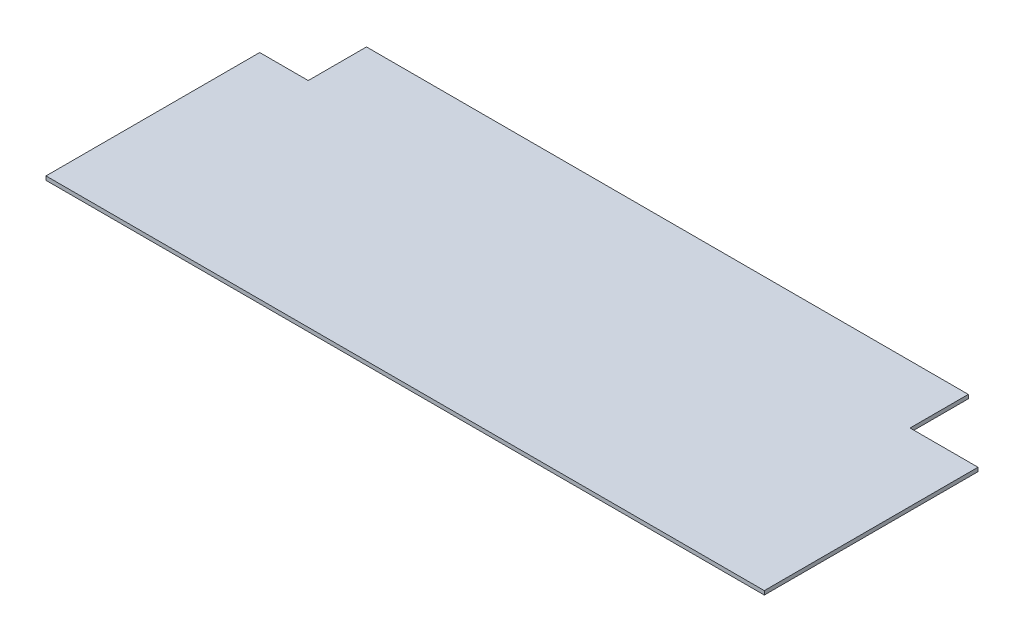
ISO-10303-21;
HEADER;
FILE_DESCRIPTION(('STEP AP214'),'2;1');
FILE_NAME('part.step','',(''),(''),'','','');
FILE_SCHEMA(('AUTOMOTIVE_DESIGN { 1 0 10303 214 1 1 1 1 }'));
ENDSEC;
DATA;
#1=APPLICATION_CONTEXT('core data for automotive mechanical design processes');
#2=APPLICATION_PROTOCOL_DEFINITION('international standard','automotive_design',2000,#1);
#3=PRODUCT_CONTEXT('',#1,'mechanical');
#4=PRODUCT('Part','Part','',(#3));
#5=PRODUCT_RELATED_PRODUCT_CATEGORY('part','',(#4));
#6=PRODUCT_DEFINITION_FORMATION('','',#4);
#7=PRODUCT_DEFINITION_CONTEXT('part definition',#1,'design');
#8=PRODUCT_DEFINITION('design','',#6,#7);
#9=PRODUCT_DEFINITION_SHAPE('','',#8);
#10=(LENGTH_UNIT() NAMED_UNIT(*) SI_UNIT(.MILLI.,.METRE.));
#11=(NAMED_UNIT(*) PLANE_ANGLE_UNIT() SI_UNIT($,.RADIAN.));
#12=(NAMED_UNIT(*) SI_UNIT($,.STERADIAN.) SOLID_ANGLE_UNIT());
#13=UNCERTAINTY_MEASURE_WITH_UNIT(LENGTH_MEASURE(1.E-05),#10,'distance_accuracy_value','');
#14=(GEOMETRIC_REPRESENTATION_CONTEXT(3) GLOBAL_UNCERTAINTY_ASSIGNED_CONTEXT((#13)) GLOBAL_UNIT_ASSIGNED_CONTEXT((#10,
#11,#12)) REPRESENTATION_CONTEXT('',''));
#15=CARTESIAN_POINT('',(0.,0.,0.));
#16=DIRECTION('',(0.,0.,1.));
#17=DIRECTION('',(1.,0.,0.));
#18=AXIS2_PLACEMENT_3D('',#15,#16,#17);
#19=CARTESIAN_POINT('',(301.178602807675,2.54,0.));
#20=DIRECTION('',(1.,0.,0.));
#21=DIRECTION('',(0.,0.,-1.));
#22=AXIS2_PLACEMENT_3D('',#19,#20,#21);
#23=PLANE('',#22);
#24=DIRECTION('',(0.,0.,1.));
#25=VECTOR('',#24,1.);
#26=CARTESIAN_POINT('',(301.178602807675,0.,0.));
#27=LINE('',#26,#25);
#28=CARTESIAN_POINT('',(301.178602807675,0.,-178.4112679147));
#29=VERTEX_POINT('',#28);
#30=CARTESIAN_POINT('',(301.178602807675,0.,-140.3112679147));
#31=VERTEX_POINT('',#30);
#32=EDGE_CURVE('E133',#29,#31,#27,.T.);
#33=ORIENTED_EDGE('',*,*,#32,.F.);
#34=DIRECTION('',(0.,-1.,0.));
#35=VECTOR('',#34,1.);
#36=CARTESIAN_POINT('',(301.178602807675,2.54,-178.4112679147));
#37=LINE('',#36,#35);
#38=CARTESIAN_POINT('',(301.178602807675,2.54,-178.4112679147));
#39=VERTEX_POINT('',#38);
#40=EDGE_CURVE('E11',#39,#29,#37,.T.);
#41=ORIENTED_EDGE('',*,*,#40,.F.);
#42=DIRECTION('',(0.,0.,1.));
#43=VECTOR('',#42,1.);
#44=CARTESIAN_POINT('',(301.178602807675,2.54,0.));
#45=LINE('',#44,#43);
#46=CARTESIAN_POINT('',(301.178602807675,2.54,-140.3112679147));
#47=VERTEX_POINT('',#46);
#48=EDGE_CURVE('E152',#39,#47,#45,.T.);
#49=ORIENTED_EDGE('',*,*,#48,.T.);
#50=DIRECTION('',(0.,-1.,0.));
#51=VECTOR('',#50,1.);
#52=CARTESIAN_POINT('',(301.178602807675,2.54,-140.3112679147));
#53=LINE('',#52,#51);
#54=EDGE_CURVE('E92',#47,#31,#53,.T.);
#55=ORIENTED_EDGE('',*,*,#54,.T.);
#56=EDGE_LOOP('',(#33,#41,#49,#55));
#57=FACE_BOUND('',#56,.T.);
#58=ADVANCED_FACE('F41',(#57),#23,.T.);
#59=CARTESIAN_POINT('',(0.,2.54,-178.4112679147));
#60=DIRECTION('',(0.,0.,-1.));
#61=DIRECTION('',(-1.,0.,0.));
#62=AXIS2_PLACEMENT_3D('',#59,#60,#61);
#63=PLANE('',#62);
#64=DIRECTION('',(1.,0.,0.));
#65=VECTOR('',#64,1.);
#66=CARTESIAN_POINT('',(0.,0.,-178.4112679147));
#67=LINE('',#66,#65);
#68=CARTESIAN_POINT('',(-92.5227972403219,0.,-178.4112679147));
#69=VERTEX_POINT('',#68);
#70=EDGE_CURVE('E136',#69,#29,#67,.T.);
#71=ORIENTED_EDGE('',*,*,#70,.F.);
#72=DIRECTION('',(0.,-1.,0.));
#73=VECTOR('',#72,1.);
#74=CARTESIAN_POINT('',(-92.5227972403219,2.54,-178.4112679147));
#75=LINE('',#74,#73);
#76=CARTESIAN_POINT('',(-92.5227972403219,2.54,-178.4112679147));
#77=VERTEX_POINT('',#76);
#78=EDGE_CURVE('E49',#77,#69,#75,.T.);
#79=ORIENTED_EDGE('',*,*,#78,.F.);
#80=DIRECTION('',(1.,0.,0.));
#81=VECTOR('',#80,1.);
#82=CARTESIAN_POINT('',(0.,2.54,-178.4112679147));
#83=LINE('',#82,#81);
#84=EDGE_CURVE('E173',#77,#39,#83,.T.);
#85=ORIENTED_EDGE('',*,*,#84,.T.);
#86=ORIENTED_EDGE('',*,*,#40,.T.);
#87=EDGE_LOOP('',(#71,#79,#85,#86));
#88=FACE_BOUND('',#87,.T.);
#89=ADVANCED_FACE('F172',(#88),#63,.T.);
#90=CARTESIAN_POINT('',(-92.5227972403219,2.54,0.));
#91=DIRECTION('',(1.,0.,0.));
#92=DIRECTION('',(0.,0.,-1.));
#93=AXIS2_PLACEMENT_3D('',#90,#91,#92);
#94=PLANE('',#93);
#95=DIRECTION('',(0.,0.,1.));
#96=VECTOR('',#95,1.);
#97=CARTESIAN_POINT('',(-92.5227972403219,0.,0.));
#98=LINE('',#97,#96);
#99=CARTESIAN_POINT('',(-92.5227972403219,0.,-140.3112679147));
#100=VERTEX_POINT('',#99);
#101=EDGE_CURVE('E139',#69,#100,#98,.T.);
#102=ORIENTED_EDGE('',*,*,#101,.T.);
#103=DIRECTION('',(0.,-1.,0.));
#104=VECTOR('',#103,1.);
#105=CARTESIAN_POINT('',(-92.5227972403219,2.54,-140.3112679147));
#106=LINE('',#105,#104);
#107=CARTESIAN_POINT('',(-92.5227972403219,2.54,-140.3112679147));
#108=VERTEX_POINT('',#107);
#109=EDGE_CURVE('E158',#108,#100,#106,.T.);
#110=ORIENTED_EDGE('',*,*,#109,.F.);
#111=DIRECTION('',(0.,0.,1.));
#112=VECTOR('',#111,1.);
#113=CARTESIAN_POINT('',(-92.5227972403219,2.54,0.));
#114=LINE('',#113,#112);
#115=EDGE_CURVE('E164',#77,#108,#114,.T.);
#116=ORIENTED_EDGE('',*,*,#115,.F.);
#117=ORIENTED_EDGE('',*,*,#78,.T.);
#118=EDGE_LOOP('',(#102,#110,#116,#117));
#119=FACE_BOUND('',#118,.T.);
#120=ADVANCED_FACE('F162',(#119),#94,.F.);
#121=CARTESIAN_POINT('',(0.,2.54,-140.3112679147));
#122=DIRECTION('',(0.,0.,-1.));
#123=DIRECTION('',(-1.,0.,0.));
#124=AXIS2_PLACEMENT_3D('',#121,#122,#123);
#125=PLANE('',#124);
#126=DIRECTION('',(1.,0.,0.));
#127=VECTOR('',#126,1.);
#128=CARTESIAN_POINT('',(0.,0.,-140.3112679147));
#129=LINE('',#128,#127);
#130=CARTESIAN_POINT('',(-124.272797240322,0.,-140.3112679147));
#131=VERTEX_POINT('',#130);
#132=EDGE_CURVE('E142',#131,#100,#129,.T.);
#133=ORIENTED_EDGE('',*,*,#132,.F.);
#134=DIRECTION('',(0.,-1.,0.));
#135=VECTOR('',#134,1.);
#136=CARTESIAN_POINT('',(-124.272797240322,2.54,-140.3112679147));
#137=LINE('',#136,#135);
#138=CARTESIAN_POINT('',(-124.272797240322,2.54,-140.3112679147));
#139=VERTEX_POINT('',#138);
#140=EDGE_CURVE('E156',#139,#131,#137,.T.);
#141=ORIENTED_EDGE('',*,*,#140,.F.);
#142=DIRECTION('',(1.,0.,0.));
#143=VECTOR('',#142,1.);
#144=CARTESIAN_POINT('',(0.,2.54,-140.3112679147));
#145=LINE('',#144,#143);
#146=EDGE_CURVE('E181',#139,#108,#145,.T.);
#147=ORIENTED_EDGE('',*,*,#146,.T.);
#148=ORIENTED_EDGE('',*,*,#109,.T.);
#149=EDGE_LOOP('',(#133,#141,#147,#148));
#150=FACE_BOUND('',#149,.T.);
#151=ADVANCED_FACE('F187',(#150),#125,.T.);
#152=CARTESIAN_POINT('',(-124.272797240322,2.54,0.));
#153=DIRECTION('',(-1.,0.,0.));
#154=DIRECTION('',(0.,0.,1.));
#155=AXIS2_PLACEMENT_3D('',#152,#153,#154);
#156=PLANE('',#155);
#157=DIRECTION('',(0.,0.,-1.));
#158=VECTOR('',#157,1.);
#159=CARTESIAN_POINT('',(-124.272797240322,0.,0.));
#160=LINE('',#159,#158);
#161=CARTESIAN_POINT('',(-124.272797240322,0.,-0.515267914670478));
#162=VERTEX_POINT('',#161);
#163=EDGE_CURVE('E145',#162,#131,#160,.T.);
#164=ORIENTED_EDGE('',*,*,#163,.F.);
#165=DIRECTION('',(0.,-1.,0.));
#166=VECTOR('',#165,1.);
#167=CARTESIAN_POINT('',(-124.272797240322,2.54,-0.515267914670478));
#168=LINE('',#167,#166);
#169=CARTESIAN_POINT('',(-124.272797240322,2.54,-0.515267914670478));
#170=VERTEX_POINT('',#169);
#171=EDGE_CURVE('E125',#170,#162,#168,.T.);
#172=ORIENTED_EDGE('',*,*,#171,.F.);
#173=DIRECTION('',(0.,0.,-1.));
#174=VECTOR('',#173,1.);
#175=CARTESIAN_POINT('',(-124.272797240322,2.54,0.));
#176=LINE('',#175,#174);
#177=EDGE_CURVE('E118',#170,#139,#176,.T.);
#178=ORIENTED_EDGE('',*,*,#177,.T.);
#179=ORIENTED_EDGE('',*,*,#140,.T.);
#180=EDGE_LOOP('',(#164,#172,#178,#179));
#181=FACE_BOUND('',#180,.T.);
#182=ADVANCED_FACE('F185',(#181),#156,.T.);
#183=CARTESIAN_POINT('',(0.,2.54,-0.515267914670478));
#184=DIRECTION('',(0.,0.,-1.));
#185=DIRECTION('',(-1.,0.,0.));
#186=AXIS2_PLACEMENT_3D('',#183,#184,#185);
#187=PLANE('',#186);
#188=DIRECTION('',(1.,0.,0.));
#189=VECTOR('',#188,1.);
#190=CARTESIAN_POINT('',(0.,0.,-0.515267914670478));
#191=LINE('',#190,#189);
#192=CARTESIAN_POINT('',(345.628602807675,0.,-0.515267914670478));
#193=VERTEX_POINT('',#192);
#194=EDGE_CURVE('E124',#162,#193,#191,.T.);
#195=ORIENTED_EDGE('',*,*,#194,.T.);
#196=DIRECTION('',(0.,-1.,0.));
#197=VECTOR('',#196,1.);
#198=CARTESIAN_POINT('',(345.628602807675,2.54,-0.515267914670478));
#199=LINE('',#198,#197);
#200=CARTESIAN_POINT('',(345.628602807675,2.54,-0.515267914670478));
#201=VERTEX_POINT('',#200);
#202=EDGE_CURVE('E121',#201,#193,#199,.T.);
#203=ORIENTED_EDGE('',*,*,#202,.F.);
#204=DIRECTION('',(1.,0.,0.));
#205=VECTOR('',#204,1.);
#206=CARTESIAN_POINT('',(0.,2.54,-0.515267914670478));
#207=LINE('',#206,#205);
#208=EDGE_CURVE('E111',#170,#201,#207,.T.);
#209=ORIENTED_EDGE('',*,*,#208,.F.);
#210=ORIENTED_EDGE('',*,*,#171,.T.);
#211=EDGE_LOOP('',(#195,#203,#209,#210));
#212=FACE_BOUND('',#211,.T.);
#213=ADVANCED_FACE('F122',(#212),#187,.F.);
#214=CARTESIAN_POINT('',(345.628602807675,2.54,0.));
#215=DIRECTION('',(-1.,0.,0.));
#216=DIRECTION('',(0.,0.,1.));
#217=AXIS2_PLACEMENT_3D('',#214,#215,#216);
#218=PLANE('',#217);
#219=DIRECTION('',(0.,0.,-1.));
#220=VECTOR('',#219,1.);
#221=CARTESIAN_POINT('',(345.628602807675,0.,0.));
#222=LINE('',#221,#220);
#223=CARTESIAN_POINT('',(345.628602807675,0.,-140.3112679147));
#224=VERTEX_POINT('',#223);
#225=EDGE_CURVE('E85',#193,#224,#222,.T.);
#226=ORIENTED_EDGE('',*,*,#225,.T.);
#227=DIRECTION('',(0.,-1.,0.));
#228=VECTOR('',#227,1.);
#229=CARTESIAN_POINT('',(345.628602807675,2.54,-140.3112679147));
#230=LINE('',#229,#228);
#231=CARTESIAN_POINT('',(345.628602807675,2.54,-140.3112679147));
#232=VERTEX_POINT('',#231);
#233=EDGE_CURVE('E126',#232,#224,#230,.T.);
#234=ORIENTED_EDGE('',*,*,#233,.F.);
#235=DIRECTION('',(0.,0.,-1.));
#236=VECTOR('',#235,1.);
#237=CARTESIAN_POINT('',(345.628602807675,2.54,0.));
#238=LINE('',#237,#236);
#239=EDGE_CURVE('E115',#201,#232,#238,.T.);
#240=ORIENTED_EDGE('',*,*,#239,.F.);
#241=ORIENTED_EDGE('',*,*,#202,.T.);
#242=EDGE_LOOP('',(#226,#234,#240,#241));
#243=FACE_BOUND('',#242,.T.);
#244=ADVANCED_FACE('F128',(#243),#218,.F.);
#245=CARTESIAN_POINT('',(0.,2.54,-140.3112679147));
#246=DIRECTION('',(0.,0.,1.));
#247=DIRECTION('',(1.,0.,0.));
#248=AXIS2_PLACEMENT_3D('',#245,#246,#247);
#249=PLANE('',#248);
#250=DIRECTION('',(-1.,0.,0.));
#251=VECTOR('',#250,1.);
#252=CARTESIAN_POINT('',(0.,0.,-140.3112679147));
#253=LINE('',#252,#251);
#254=EDGE_CURVE('E150',#224,#31,#253,.T.);
#255=ORIENTED_EDGE('',*,*,#254,.T.);
#256=ORIENTED_EDGE('',*,*,#54,.F.);
#257=DIRECTION('',(-1.,0.,0.));
#258=VECTOR('',#257,1.);
#259=CARTESIAN_POINT('',(0.,2.54,-140.3112679147));
#260=LINE('',#259,#258);
#261=EDGE_CURVE('E57',#232,#47,#260,.T.);
#262=ORIENTED_EDGE('',*,*,#261,.F.);
#263=ORIENTED_EDGE('',*,*,#233,.T.);
#264=EDGE_LOOP('',(#255,#256,#262,#263));
#265=FACE_BOUND('',#264,.T.);
#266=ADVANCED_FACE('F176',(#265),#249,.F.);
#267=CARTESIAN_POINT('',(0.,2.54,0.));
#268=DIRECTION('',(0.,1.,0.));
#269=DIRECTION('',(0.,0.,1.));
#270=AXIS2_PLACEMENT_3D('',#267,#268,#269);
#271=PLANE('',#270);
#272=ORIENTED_EDGE('',*,*,#48,.F.);
#273=ORIENTED_EDGE('',*,*,#84,.F.);
#274=ORIENTED_EDGE('',*,*,#115,.T.);
#275=ORIENTED_EDGE('',*,*,#146,.F.);
#276=ORIENTED_EDGE('',*,*,#177,.F.);
#277=ORIENTED_EDGE('',*,*,#208,.T.);
#278=ORIENTED_EDGE('',*,*,#239,.T.);
#279=ORIENTED_EDGE('',*,*,#261,.T.);
#280=EDGE_LOOP('',(#272,#273,#274,#275,#276,#277,#278,#279));
#281=FACE_BOUND('',#280,.T.);
#282=ADVANCED_FACE('F113',(#281),#271,.T.);
#283=CARTESIAN_POINT('',(0.,0.,0.));
#284=DIRECTION('',(0.,1.,0.));
#285=DIRECTION('',(0.,0.,1.));
#286=AXIS2_PLACEMENT_3D('',#283,#284,#285);
#287=PLANE('',#286);
#288=ORIENTED_EDGE('',*,*,#32,.T.);
#289=ORIENTED_EDGE('',*,*,#254,.F.);
#290=ORIENTED_EDGE('',*,*,#225,.F.);
#291=ORIENTED_EDGE('',*,*,#194,.F.);
#292=ORIENTED_EDGE('',*,*,#163,.T.);
#293=ORIENTED_EDGE('',*,*,#132,.T.);
#294=ORIENTED_EDGE('',*,*,#101,.F.);
#295=ORIENTED_EDGE('',*,*,#70,.T.);
#296=EDGE_LOOP('',(#288,#289,#290,#291,#292,#293,#294,#295));
#297=FACE_BOUND('',#296,.T.);
#298=ADVANCED_FACE('F170',(#297),#287,.F.);
#299=CLOSED_SHELL('',(#58,#89,#120,#151,#182,#213,#244,#266,#282,#298));
#300=MANIFOLD_SOLID_BREP('B2',#299);
#301=ADVANCED_BREP_SHAPE_REPRESENTATION('',(#18,#300),#14);
#302=SHAPE_DEFINITION_REPRESENTATION(#9,#301);
ENDSEC;
END-ISO-10303-21;
